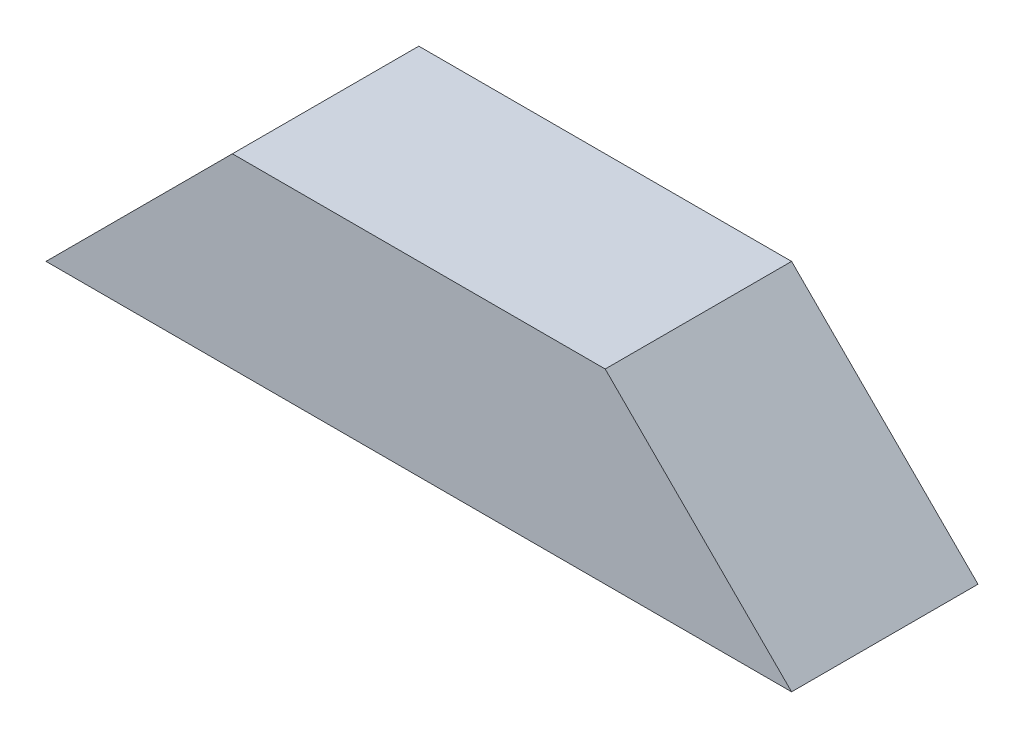
ISO-10303-21;
HEADER;
FILE_DESCRIPTION(('STEP AP214'),'2;1');
FILE_NAME('part.step','',(''),(''),'','','');
FILE_SCHEMA(('AUTOMOTIVE_DESIGN { 1 0 10303 214 1 1 1 1 }'));
ENDSEC;
DATA;
#1=APPLICATION_CONTEXT('core data for automotive mechanical design processes');
#2=APPLICATION_PROTOCOL_DEFINITION('international standard','automotive_design',2000,#1);
#3=PRODUCT_CONTEXT('',#1,'mechanical');
#4=PRODUCT('Part','Part','',(#3));
#5=PRODUCT_RELATED_PRODUCT_CATEGORY('part','',(#4));
#6=PRODUCT_DEFINITION_FORMATION('','',#4);
#7=PRODUCT_DEFINITION_CONTEXT('part definition',#1,'design');
#8=PRODUCT_DEFINITION('design','',#6,#7);
#9=PRODUCT_DEFINITION_SHAPE('','',#8);
#10=(LENGTH_UNIT() NAMED_UNIT(*) SI_UNIT(.MILLI.,.METRE.));
#11=(NAMED_UNIT(*) PLANE_ANGLE_UNIT() SI_UNIT($,.RADIAN.));
#12=(NAMED_UNIT(*) SI_UNIT($,.STERADIAN.) SOLID_ANGLE_UNIT());
#13=UNCERTAINTY_MEASURE_WITH_UNIT(LENGTH_MEASURE(1.E-05),#10,'distance_accuracy_value','');
#14=(GEOMETRIC_REPRESENTATION_CONTEXT(3) GLOBAL_UNCERTAINTY_ASSIGNED_CONTEXT((#13)) GLOBAL_UNIT_ASSIGNED_CONTEXT((#10,
#11,#12)) REPRESENTATION_CONTEXT('',''));
#15=CARTESIAN_POINT('',(0.,0.,0.));
#16=DIRECTION('',(0.,0.,1.));
#17=DIRECTION('',(1.,0.,0.));
#18=AXIS2_PLACEMENT_3D('',#15,#16,#17);
#19=CARTESIAN_POINT('',(0.,0.,20.));
#20=DIRECTION('',(0.,1.,0.));
#21=DIRECTION('',(0.,0.,1.));
#22=AXIS2_PLACEMENT_3D('',#19,#20,#21);
#23=PLANE('',#22);
#24=DIRECTION('',(1.,0.,0.));
#25=VECTOR('',#24,1.);
#26=CARTESIAN_POINT('',(0.,0.,0.));
#27=LINE('',#26,#25);
#28=CARTESIAN_POINT('',(0.,0.,0.));
#29=VERTEX_POINT('',#28);
#30=CARTESIAN_POINT('',(80.,0.,0.));
#31=VERTEX_POINT('',#30);
#32=EDGE_CURVE('E78',#29,#31,#27,.T.);
#33=ORIENTED_EDGE('',*,*,#32,.T.);
#34=DIRECTION('',(0.,0.,-1.));
#35=VECTOR('',#34,1.);
#36=CARTESIAN_POINT('',(80.,0.,20.));
#37=LINE('',#36,#35);
#38=CARTESIAN_POINT('',(80.,0.,20.));
#39=VERTEX_POINT('',#38);
#40=EDGE_CURVE('E39',#39,#31,#37,.T.);
#41=ORIENTED_EDGE('',*,*,#40,.F.);
#42=DIRECTION('',(1.,0.,0.));
#43=VECTOR('',#42,1.);
#44=CARTESIAN_POINT('',(0.,0.,20.));
#45=LINE('',#44,#43);
#46=CARTESIAN_POINT('',(0.,0.,20.));
#47=VERTEX_POINT('',#46);
#48=EDGE_CURVE('E87',#47,#39,#45,.T.);
#49=ORIENTED_EDGE('',*,*,#48,.F.);
#50=DIRECTION('',(0.,0.,-1.));
#51=VECTOR('',#50,1.);
#52=CARTESIAN_POINT('',(0.,0.,20.));
#53=LINE('',#52,#51);
#54=EDGE_CURVE('E11',#47,#29,#53,.T.);
#55=ORIENTED_EDGE('',*,*,#54,.T.);
#56=EDGE_LOOP('',(#33,#41,#49,#55));
#57=FACE_BOUND('',#56,.T.);
#58=ADVANCED_FACE('F32',(#57),#23,.F.);
#59=CARTESIAN_POINT('',(0.,20.,20.));
#60=DIRECTION('',(0.,-1.,0.));
#61=DIRECTION('',(0.,0.,-1.));
#62=AXIS2_PLACEMENT_3D('',#59,#60,#61);
#63=PLANE('',#62);
#64=DIRECTION('',(-1.,0.,0.));
#65=VECTOR('',#64,1.);
#66=CARTESIAN_POINT('',(0.,20.,0.));
#67=LINE('',#66,#65);
#68=CARTESIAN_POINT('',(59.9999999999998,20.,0.));
#69=VERTEX_POINT('',#68);
#70=CARTESIAN_POINT('',(20.0000000000002,20.,0.));
#71=VERTEX_POINT('',#70);
#72=EDGE_CURVE('E82',#69,#71,#67,.T.);
#73=ORIENTED_EDGE('',*,*,#72,.T.);
#74=DIRECTION('',(0.,0.,1.));
#75=VECTOR('',#74,1.);
#76=CARTESIAN_POINT('',(20.0000000000002,20.,0.));
#77=LINE('',#76,#75);
#78=CARTESIAN_POINT('',(20.0000000000002,20.,20.));
#79=VERTEX_POINT('',#78);
#80=EDGE_CURVE('E46',#71,#79,#77,.T.);
#81=ORIENTED_EDGE('',*,*,#80,.T.);
#82=DIRECTION('',(-1.,0.,0.));
#83=VECTOR('',#82,1.);
#84=CARTESIAN_POINT('',(0.,20.,20.));
#85=LINE('',#84,#83);
#86=CARTESIAN_POINT('',(59.9999999999998,20.,20.));
#87=VERTEX_POINT('',#86);
#88=EDGE_CURVE('E90',#87,#79,#85,.T.);
#89=ORIENTED_EDGE('',*,*,#88,.F.);
#90=DIRECTION('',(0.,0.,1.));
#91=VECTOR('',#90,1.);
#92=CARTESIAN_POINT('',(59.9999999999998,20.,0.));
#93=LINE('',#92,#91);
#94=EDGE_CURVE('E75',#69,#87,#93,.T.);
#95=ORIENTED_EDGE('',*,*,#94,.F.);
#96=EDGE_LOOP('',(#73,#81,#89,#95));
#97=FACE_BOUND('',#96,.T.);
#98=ADVANCED_FACE('F103',(#97),#63,.F.);
#99=CARTESIAN_POINT('',(0.,0.,20.));
#100=DIRECTION('',(0.,0.,-1.));
#101=DIRECTION('',(-1.,0.,0.));
#102=AXIS2_PLACEMENT_3D('',#99,#100,#101);
#103=PLANE('',#102);
#104=ORIENTED_EDGE('',*,*,#88,.T.);
#105=DIRECTION('',(-0.707106781186551,-0.707106781186544,0.));
#106=VECTOR('',#105,1.);
#107=CARTESIAN_POINT('',(0.,0.,20.));
#108=LINE('',#107,#106);
#109=EDGE_CURVE('E83',#79,#47,#108,.T.);
#110=ORIENTED_EDGE('',*,*,#109,.T.);
#111=ORIENTED_EDGE('',*,*,#48,.T.);
#112=DIRECTION('',(-0.707106781186551,0.707106781186544,0.));
#113=VECTOR('',#112,1.);
#114=CARTESIAN_POINT('',(39.9999999999996,40.,20.));
#115=LINE('',#114,#113);
#116=EDGE_CURVE('E97',#39,#87,#115,.T.);
#117=ORIENTED_EDGE('',*,*,#116,.T.);
#118=EDGE_LOOP('',(#104,#110,#111,#117));
#119=FACE_BOUND('',#118,.T.);
#120=ADVANCED_FACE('F105',(#119),#103,.F.);
#121=CARTESIAN_POINT('',(0.,0.,0.));
#122=DIRECTION('',(0.,0.,-1.));
#123=DIRECTION('',(-1.,0.,0.));
#124=AXIS2_PLACEMENT_3D('',#121,#122,#123);
#125=PLANE('',#124);
#126=DIRECTION('',(0.707106781186551,0.707106781186544,0.));
#127=VECTOR('',#126,1.);
#128=CARTESIAN_POINT('',(20.0000000000002,20.,0.));
#129=LINE('',#128,#127);
#130=EDGE_CURVE('E68',#29,#71,#129,.T.);
#131=ORIENTED_EDGE('',*,*,#130,.T.);
#132=ORIENTED_EDGE('',*,*,#72,.F.);
#133=DIRECTION('',(0.707106781186551,-0.707106781186544,0.));
#134=VECTOR('',#133,1.);
#135=CARTESIAN_POINT('',(59.9999999999998,20.,0.));
#136=LINE('',#135,#134);
#137=EDGE_CURVE('E80',#69,#31,#136,.T.);
#138=ORIENTED_EDGE('',*,*,#137,.T.);
#139=ORIENTED_EDGE('',*,*,#32,.F.);
#140=EDGE_LOOP('',(#131,#132,#138,#139));
#141=FACE_BOUND('',#140,.T.);
#142=ADVANCED_FACE('F79',(#141),#125,.T.);
#143=CARTESIAN_POINT('',(59.9999999999998,20.,0.));
#144=DIRECTION('',(-0.707106781186544,-0.707106781186551,0.));
#145=DIRECTION('',(0.707106781186551,-0.707106781186544,0.));
#146=AXIS2_PLACEMENT_3D('',#143,#144,#145);
#147=PLANE('',#146);
#148=ORIENTED_EDGE('',*,*,#40,.T.);
#149=ORIENTED_EDGE('',*,*,#137,.F.);
#150=ORIENTED_EDGE('',*,*,#94,.T.);
#151=ORIENTED_EDGE('',*,*,#116,.F.);
#152=EDGE_LOOP('',(#148,#149,#150,#151));
#153=FACE_BOUND('',#152,.T.);
#154=ADVANCED_FACE('F106',(#153),#147,.F.);
#155=CARTESIAN_POINT('',(20.0000000000002,20.,0.));
#156=DIRECTION('',(0.707106781186544,-0.707106781186551,0.));
#157=DIRECTION('',(0.707106781186551,0.707106781186544,0.));
#158=AXIS2_PLACEMENT_3D('',#155,#156,#157);
#159=PLANE('',#158);
#160=ORIENTED_EDGE('',*,*,#80,.F.);
#161=ORIENTED_EDGE('',*,*,#130,.F.);
#162=ORIENTED_EDGE('',*,*,#54,.F.);
#163=ORIENTED_EDGE('',*,*,#109,.F.);
#164=EDGE_LOOP('',(#160,#161,#162,#163));
#165=FACE_BOUND('',#164,.T.);
#166=ADVANCED_FACE('F70',(#165),#159,.F.);
#167=CLOSED_SHELL('',(#58,#98,#120,#142,#154,#166));
#168=MANIFOLD_SOLID_BREP('B2',#167);
#169=ADVANCED_BREP_SHAPE_REPRESENTATION('',(#18,#168),#14);
#170=SHAPE_DEFINITION_REPRESENTATION(#9,#169);
ENDSEC;
END-ISO-10303-21;
